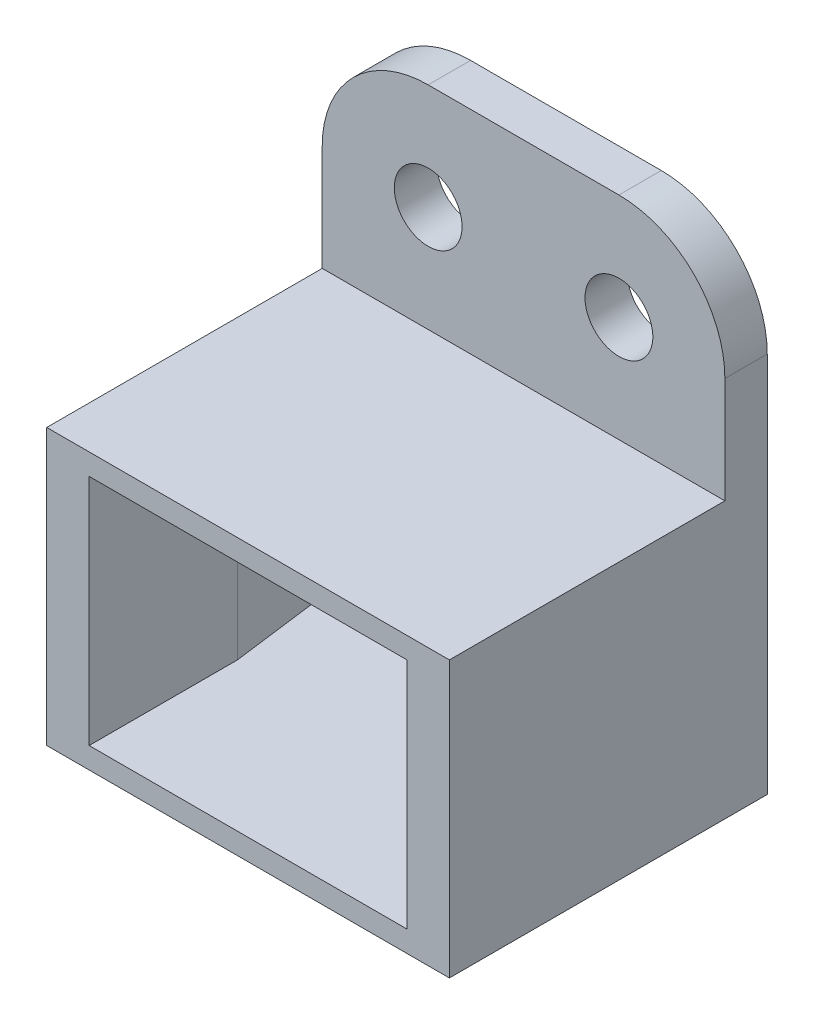
ISO-10303-21;
HEADER;
FILE_DESCRIPTION(('STEP AP214'),'2;1');
FILE_NAME('part.step','',(''),(''),'','','');
FILE_SCHEMA(('AUTOMOTIVE_DESIGN { 1 0 10303 214 1 1 1 1 }'));
ENDSEC;
DATA;
#1=APPLICATION_CONTEXT('core data for automotive mechanical design processes');
#2=APPLICATION_PROTOCOL_DEFINITION('international standard','automotive_design',2000,#1);
#3=PRODUCT_CONTEXT('',#1,'mechanical');
#4=PRODUCT('Part','Part','',(#3));
#5=PRODUCT_RELATED_PRODUCT_CATEGORY('part','',(#4));
#6=PRODUCT_DEFINITION_FORMATION('','',#4);
#7=PRODUCT_DEFINITION_CONTEXT('part definition',#1,'design');
#8=PRODUCT_DEFINITION('design','',#6,#7);
#9=PRODUCT_DEFINITION_SHAPE('','',#8);
#10=(LENGTH_UNIT() NAMED_UNIT(*) SI_UNIT(.MILLI.,.METRE.));
#11=(NAMED_UNIT(*) PLANE_ANGLE_UNIT() SI_UNIT($,.RADIAN.));
#12=(NAMED_UNIT(*) SI_UNIT($,.STERADIAN.) SOLID_ANGLE_UNIT());
#13=UNCERTAINTY_MEASURE_WITH_UNIT(LENGTH_MEASURE(1.E-05),#10,'distance_accuracy_value','');
#14=(GEOMETRIC_REPRESENTATION_CONTEXT(3) GLOBAL_UNCERTAINTY_ASSIGNED_CONTEXT((#13)) GLOBAL_UNIT_ASSIGNED_CONTEXT((#10,
#11,#12)) REPRESENTATION_CONTEXT('',''));
#15=CARTESIAN_POINT('',(0.,0.,0.));
#16=DIRECTION('',(0.,0.,1.));
#17=DIRECTION('',(1.,0.,0.));
#18=AXIS2_PLACEMENT_3D('',#15,#16,#17);
#19=CARTESIAN_POINT('',(15.,-11.,30.));
#20=DIRECTION('',(-1.,0.,0.));
#21=DIRECTION('',(0.,0.,1.));
#22=AXIS2_PLACEMENT_3D('',#19,#20,#21);
#23=PLANE('',#22);
#24=DIRECTION('',(0.,0.,-1.));
#25=VECTOR('',#24,1.);
#26=CARTESIAN_POINT('',(15.,11.,30.));
#27=LINE('',#26,#25);
#28=CARTESIAN_POINT('',(15.,11.,30.));
#29=VERTEX_POINT('',#28);
#30=CARTESIAN_POINT('',(15.,11.,16.));
#31=VERTEX_POINT('',#30);
#32=EDGE_CURVE('E254',#29,#31,#27,.T.);
#33=ORIENTED_EDGE('',*,*,#32,.T.);
#34=DIRECTION('',(0.,1.,0.));
#35=VECTOR('',#34,1.);
#36=CARTESIAN_POINT('',(15.,-27.0701586799882,16.));
#37=LINE('',#36,#35);
#38=CARTESIAN_POINT('',(15.,-11.,16.));
#39=VERTEX_POINT('',#38);
#40=EDGE_CURVE('E207',#39,#31,#37,.T.);
#41=ORIENTED_EDGE('',*,*,#40,.F.);
#42=DIRECTION('',(0.,0.,-1.));
#43=VECTOR('',#42,1.);
#44=CARTESIAN_POINT('',(15.,-11.,30.));
#45=LINE('',#44,#43);
#46=CARTESIAN_POINT('',(15.,-11.,30.));
#47=VERTEX_POINT('',#46);
#48=EDGE_CURVE('E235',#47,#39,#45,.T.);
#49=ORIENTED_EDGE('',*,*,#48,.F.);
#50=DIRECTION('',(0.,1.,0.));
#51=VECTOR('',#50,1.);
#52=CARTESIAN_POINT('',(15.,-11.,30.));
#53=LINE('',#52,#51);
#54=EDGE_CURVE('E225',#47,#29,#53,.T.);
#55=ORIENTED_EDGE('',*,*,#54,.T.);
#56=EDGE_LOOP('',(#33,#41,#49,#55));
#57=FACE_BOUND('',#56,.T.);
#58=ADVANCED_FACE('F33',(#57),#23,.T.);
#59=CARTESIAN_POINT('',(-15.,-11.,30.));
#60=DIRECTION('',(1.,0.,0.));
#61=DIRECTION('',(0.,0.,-1.));
#62=AXIS2_PLACEMENT_3D('',#59,#60,#61);
#63=PLANE('',#62);
#64=DIRECTION('',(0.,0.,-1.));
#65=VECTOR('',#64,1.);
#66=CARTESIAN_POINT('',(-15.,-11.,30.));
#67=LINE('',#66,#65);
#68=CARTESIAN_POINT('',(-15.,-11.,30.));
#69=VERTEX_POINT('',#68);
#70=CARTESIAN_POINT('',(-15.,-11.,16.));
#71=VERTEX_POINT('',#70);
#72=EDGE_CURVE('E248',#69,#71,#67,.T.);
#73=ORIENTED_EDGE('',*,*,#72,.T.);
#74=DIRECTION('',(0.,1.,0.));
#75=VECTOR('',#74,1.);
#76=CARTESIAN_POINT('',(-15.,-27.0701586799882,16.));
#77=LINE('',#76,#75);
#78=CARTESIAN_POINT('',(-15.,11.,16.));
#79=VERTEX_POINT('',#78);
#80=EDGE_CURVE('E56',#71,#79,#77,.T.);
#81=ORIENTED_EDGE('',*,*,#80,.T.);
#82=DIRECTION('',(0.,0.,-1.));
#83=VECTOR('',#82,1.);
#84=CARTESIAN_POINT('',(-15.,11.,30.));
#85=LINE('',#84,#83);
#86=CARTESIAN_POINT('',(-15.,11.,30.));
#87=VERTEX_POINT('',#86);
#88=EDGE_CURVE('E251',#87,#79,#85,.T.);
#89=ORIENTED_EDGE('',*,*,#88,.F.);
#90=DIRECTION('',(0.,-1.,0.));
#91=VECTOR('',#90,1.);
#92=CARTESIAN_POINT('',(-15.,-11.,30.));
#93=LINE('',#92,#91);
#94=EDGE_CURVE('E230',#87,#69,#93,.T.);
#95=ORIENTED_EDGE('',*,*,#94,.T.);
#96=EDGE_LOOP('',(#73,#81,#89,#95));
#97=FACE_BOUND('',#96,.T.);
#98=ADVANCED_FACE('F306',(#97),#63,.T.);
#99=CARTESIAN_POINT('',(0.,0.,30.));
#100=DIRECTION('',(0.,0.,1.));
#101=DIRECTION('',(1.,0.,0.));
#102=AXIS2_PLACEMENT_3D('',#99,#100,#101);
#103=PLANE('',#102);
#104=DIRECTION('',(0.,-1.,0.));
#105=VECTOR('',#104,1.);
#106=CARTESIAN_POINT('',(-19.,-13.,30.));
#107=LINE('',#106,#105);
#108=CARTESIAN_POINT('',(-19.,13.,30.));
#109=VERTEX_POINT('',#108);
#110=CARTESIAN_POINT('',(-19.,-13.,30.));
#111=VERTEX_POINT('',#110);
#112=EDGE_CURVE('E258',#109,#111,#107,.T.);
#113=ORIENTED_EDGE('',*,*,#112,.T.);
#114=DIRECTION('',(1.,0.,0.));
#115=VECTOR('',#114,1.);
#116=CARTESIAN_POINT('',(19.,-13.,30.));
#117=LINE('',#116,#115);
#118=CARTESIAN_POINT('',(19.,-13.,30.));
#119=VERTEX_POINT('',#118);
#120=EDGE_CURVE('E261',#111,#119,#117,.T.);
#121=ORIENTED_EDGE('',*,*,#120,.T.);
#122=DIRECTION('',(0.,1.,0.));
#123=VECTOR('',#122,1.);
#124=CARTESIAN_POINT('',(19.,-13.,30.));
#125=LINE('',#124,#123);
#126=CARTESIAN_POINT('',(19.,13.,30.));
#127=VERTEX_POINT('',#126);
#128=EDGE_CURVE('E264',#119,#127,#125,.T.);
#129=ORIENTED_EDGE('',*,*,#128,.T.);
#130=DIRECTION('',(-1.,0.,0.));
#131=VECTOR('',#130,1.);
#132=CARTESIAN_POINT('',(19.,13.,30.));
#133=LINE('',#132,#131);
#134=EDGE_CURVE('E266',#127,#109,#133,.T.);
#135=ORIENTED_EDGE('',*,*,#134,.T.);
#136=EDGE_LOOP('',(#113,#121,#129,#135));
#137=FACE_BOUND('',#136,.T.);
#138=DIRECTION('',(-1.,0.,0.));
#139=VECTOR('',#138,1.);
#140=CARTESIAN_POINT('',(-15.,11.,30.));
#141=LINE('',#140,#139);
#142=EDGE_CURVE('E227',#29,#87,#141,.T.);
#143=ORIENTED_EDGE('',*,*,#142,.F.);
#144=ORIENTED_EDGE('',*,*,#54,.F.);
#145=DIRECTION('',(1.,0.,0.));
#146=VECTOR('',#145,1.);
#147=CARTESIAN_POINT('',(-15.,-11.,30.));
#148=LINE('',#147,#146);
#149=EDGE_CURVE('E233',#69,#47,#148,.T.);
#150=ORIENTED_EDGE('',*,*,#149,.F.);
#151=ORIENTED_EDGE('',*,*,#94,.F.);
#152=EDGE_LOOP('',(#143,#144,#150,#151));
#153=FACE_BOUND('',#152,.T.);
#154=ADVANCED_FACE('F295',(#137,#153),#103,.T.);
#155=CARTESIAN_POINT('',(0.,0.,0.));
#156=DIRECTION('',(0.,0.,1.));
#157=DIRECTION('',(1.,0.,0.));
#158=AXIS2_PLACEMENT_3D('',#155,#156,#157);
#159=PLANE('',#158);
#160=DIRECTION('',(0.,-1.,0.));
#161=VECTOR('',#160,1.);
#162=CARTESIAN_POINT('',(-19.,-13.,0.));
#163=LINE('',#162,#161);
#164=CARTESIAN_POINT('',(-19.,22.9999999999999,0.));
#165=VERTEX_POINT('',#164);
#166=CARTESIAN_POINT('',(-19.,-13.,0.));
#167=VERTEX_POINT('',#166);
#168=EDGE_CURVE('E257',#165,#167,#163,.T.);
#169=ORIENTED_EDGE('',*,*,#168,.F.);
#170=CARTESIAN_POINT('',(-9.,23.,0.));
#171=DIRECTION('',(0.,0.,-1.));
#172=DIRECTION('',(-1.,0.,0.));
#173=AXIS2_PLACEMENT_3D('',#170,#171,#172);
#174=CIRCLE('',#173,10.);
#175=CARTESIAN_POINT('',(-8.99999999999993,33.,0.));
#176=VERTEX_POINT('',#175);
#177=EDGE_CURVE('E153',#165,#176,#174,.T.);
#178=ORIENTED_EDGE('',*,*,#177,.T.);
#179=DIRECTION('',(1.,0.,0.));
#180=VECTOR('',#179,1.);
#181=CARTESIAN_POINT('',(-8.99999999999993,33.,0.));
#182=LINE('',#181,#180);
#183=CARTESIAN_POINT('',(8.99999999999993,33.,0.));
#184=VERTEX_POINT('',#183);
#185=EDGE_CURVE('E172',#176,#184,#182,.T.);
#186=ORIENTED_EDGE('',*,*,#185,.T.);
#187=CARTESIAN_POINT('',(9.00000000000001,23.,0.));
#188=DIRECTION('',(0.,0.,-1.));
#189=DIRECTION('',(-1.,0.,0.));
#190=AXIS2_PLACEMENT_3D('',#187,#188,#189);
#191=CIRCLE('',#190,10.);
#192=CARTESIAN_POINT('',(19.,22.9999999999999,0.));
#193=VERTEX_POINT('',#192);
#194=EDGE_CURVE('E169',#184,#193,#191,.T.);
#195=ORIENTED_EDGE('',*,*,#194,.T.);
#196=DIRECTION('',(0.,1.,0.));
#197=VECTOR('',#196,1.);
#198=CARTESIAN_POINT('',(19.,-13.,0.));
#199=LINE('',#198,#197);
#200=CARTESIAN_POINT('',(19.,-13.,0.));
#201=VERTEX_POINT('',#200);
#202=EDGE_CURVE('E262',#201,#193,#199,.T.);
#203=ORIENTED_EDGE('',*,*,#202,.F.);
#204=DIRECTION('',(1.,0.,0.));
#205=VECTOR('',#204,1.);
#206=CARTESIAN_POINT('',(19.,-13.,0.));
#207=LINE('',#206,#205);
#208=EDGE_CURVE('E269',#167,#201,#207,.T.);
#209=ORIENTED_EDGE('',*,*,#208,.F.);
#210=EDGE_LOOP('',(#169,#178,#186,#195,#203,#209));
#211=FACE_BOUND('',#210,.T.);
#212=DIRECTION('',(0.,1.,0.));
#213=VECTOR('',#212,1.);
#214=CARTESIAN_POINT('',(15.,-11.,0.));
#215=LINE('',#214,#213);
#216=CARTESIAN_POINT('',(15.,-11.,0.));
#217=VERTEX_POINT('',#216);
#218=CARTESIAN_POINT('',(15.,11.,0.));
#219=VERTEX_POINT('',#218);
#220=EDGE_CURVE('E198',#217,#219,#215,.T.);
#221=ORIENTED_EDGE('',*,*,#220,.T.);
#222=DIRECTION('',(-1.,0.,0.));
#223=VECTOR('',#222,1.);
#224=CARTESIAN_POINT('',(-15.,11.,0.));
#225=LINE('',#224,#223);
#226=CARTESIAN_POINT('',(-15.,11.,0.));
#227=VERTEX_POINT('',#226);
#228=EDGE_CURVE('E238',#219,#227,#225,.T.);
#229=ORIENTED_EDGE('',*,*,#228,.T.);
#230=DIRECTION('',(0.,-1.,0.));
#231=VECTOR('',#230,1.);
#232=CARTESIAN_POINT('',(-15.,-11.,0.));
#233=LINE('',#232,#231);
#234=CARTESIAN_POINT('',(-15.,-11.,0.));
#235=VERTEX_POINT('',#234);
#236=EDGE_CURVE('E241',#227,#235,#233,.T.);
#237=ORIENTED_EDGE('',*,*,#236,.T.);
#238=DIRECTION('',(1.,0.,0.));
#239=VECTOR('',#238,1.);
#240=CARTESIAN_POINT('',(-15.,-11.,0.));
#241=LINE('',#240,#239);
#242=EDGE_CURVE('E228',#235,#217,#241,.T.);
#243=ORIENTED_EDGE('',*,*,#242,.T.);
#244=EDGE_LOOP('',(#221,#229,#237,#243));
#245=FACE_BOUND('',#244,.T.);
#246=CARTESIAN_POINT('',(-9.,23.,0.));
#247=DIRECTION('',(0.,0.,-1.));
#248=DIRECTION('',(-1.,0.,0.));
#249=AXIS2_PLACEMENT_3D('',#246,#247,#248);
#250=CIRCLE('',#249,3.2);
#251=CARTESIAN_POINT('',(-12.2,23.,0.));
#252=VERTEX_POINT('',#251);
#253=EDGE_CURVE('E392',#252,#252,#250,.T.);
#254=ORIENTED_EDGE('',*,*,#253,.F.);
#255=EDGE_LOOP('',(#254));
#256=FACE_BOUND('',#255,.T.);
#257=CARTESIAN_POINT('',(9.00000000000001,23.,0.));
#258=DIRECTION('',(0.,0.,-1.));
#259=DIRECTION('',(-1.,0.,0.));
#260=AXIS2_PLACEMENT_3D('',#257,#258,#259);
#261=CIRCLE('',#260,3.2);
#262=CARTESIAN_POINT('',(5.80000000000001,23.,0.));
#263=VERTEX_POINT('',#262);
#264=EDGE_CURVE('E175',#263,#263,#261,.T.);
#265=ORIENTED_EDGE('',*,*,#264,.F.);
#266=EDGE_LOOP('',(#265));
#267=FACE_BOUND('',#266,.T.);
#268=ADVANCED_FACE('F284',(#211,#245,#256,#267),#159,.F.);
#269=CARTESIAN_POINT('',(-19.,-13.,30.));
#270=DIRECTION('',(1.,0.,0.));
#271=DIRECTION('',(0.,0.,-1.));
#272=AXIS2_PLACEMENT_3D('',#269,#270,#271);
#273=PLANE('',#272);
#274=ORIENTED_EDGE('',*,*,#168,.T.);
#275=DIRECTION('',(0.,0.,-1.));
#276=VECTOR('',#275,1.);
#277=CARTESIAN_POINT('',(-19.,-13.,30.));
#278=LINE('',#277,#276);
#279=EDGE_CURVE('E11',#111,#167,#278,.T.);
#280=ORIENTED_EDGE('',*,*,#279,.F.);
#281=ORIENTED_EDGE('',*,*,#112,.F.);
#282=DIRECTION('',(0.,0.,-1.));
#283=VECTOR('',#282,1.);
#284=CARTESIAN_POINT('',(-19.,13.,30.));
#285=LINE('',#284,#283);
#286=CARTESIAN_POINT('',(-19.,13.,4.));
#287=VERTEX_POINT('',#286);
#288=EDGE_CURVE('E168',#109,#287,#285,.T.);
#289=ORIENTED_EDGE('',*,*,#288,.T.);
#290=DIRECTION('',(0.,1.,0.));
#291=VECTOR('',#290,1.);
#292=CARTESIAN_POINT('',(-19.,13.,4.));
#293=LINE('',#292,#291);
#294=CARTESIAN_POINT('',(-19.,22.9999999999999,4.));
#295=VERTEX_POINT('',#294);
#296=EDGE_CURVE('E48',#287,#295,#293,.T.);
#297=ORIENTED_EDGE('',*,*,#296,.T.);
#298=DIRECTION('',(0.,0.,-1.));
#299=VECTOR('',#298,1.);
#300=CARTESIAN_POINT('',(-19.,22.9999999999999,4.));
#301=LINE('',#300,#299);
#302=EDGE_CURVE('E149',#295,#165,#301,.T.);
#303=ORIENTED_EDGE('',*,*,#302,.T.);
#304=EDGE_LOOP('',(#274,#280,#281,#289,#297,#303));
#305=FACE_BOUND('',#304,.T.);
#306=ADVANCED_FACE('F35',(#305),#273,.F.);
#307=CARTESIAN_POINT('',(19.,-13.,30.));
#308=DIRECTION('',(0.,1.,0.));
#309=DIRECTION('',(0.,0.,1.));
#310=AXIS2_PLACEMENT_3D('',#307,#308,#309);
#311=PLANE('',#310);
#312=ORIENTED_EDGE('',*,*,#208,.T.);
#313=DIRECTION('',(0.,0.,-1.));
#314=VECTOR('',#313,1.);
#315=CARTESIAN_POINT('',(19.,-13.,30.));
#316=LINE('',#315,#314);
#317=EDGE_CURVE('E41',#119,#201,#316,.T.);
#318=ORIENTED_EDGE('',*,*,#317,.F.);
#319=ORIENTED_EDGE('',*,*,#120,.F.);
#320=ORIENTED_EDGE('',*,*,#279,.T.);
#321=EDGE_LOOP('',(#312,#318,#319,#320));
#322=FACE_BOUND('',#321,.T.);
#323=ADVANCED_FACE('F298',(#322),#311,.F.);
#324=CARTESIAN_POINT('',(19.,-13.,30.));
#325=DIRECTION('',(-1.,0.,0.));
#326=DIRECTION('',(0.,0.,1.));
#327=AXIS2_PLACEMENT_3D('',#324,#325,#326);
#328=PLANE('',#327);
#329=ORIENTED_EDGE('',*,*,#202,.T.);
#330=DIRECTION('',(0.,0.,-1.));
#331=VECTOR('',#330,1.);
#332=CARTESIAN_POINT('',(19.,22.9999999999999,4.));
#333=LINE('',#332,#331);
#334=CARTESIAN_POINT('',(19.,22.9999999999999,4.));
#335=VERTEX_POINT('',#334);
#336=EDGE_CURVE('E189',#335,#193,#333,.T.);
#337=ORIENTED_EDGE('',*,*,#336,.F.);
#338=DIRECTION('',(0.,-1.,0.));
#339=VECTOR('',#338,1.);
#340=CARTESIAN_POINT('',(19.,13.,4.));
#341=LINE('',#340,#339);
#342=CARTESIAN_POINT('',(19.,13.,4.));
#343=VERTEX_POINT('',#342);
#344=EDGE_CURVE('E182',#335,#343,#341,.T.);
#345=ORIENTED_EDGE('',*,*,#344,.T.);
#346=DIRECTION('',(0.,0.,-1.));
#347=VECTOR('',#346,1.);
#348=CARTESIAN_POINT('',(19.,13.,30.));
#349=LINE('',#348,#347);
#350=EDGE_CURVE('E273',#127,#343,#349,.T.);
#351=ORIENTED_EDGE('',*,*,#350,.F.);
#352=ORIENTED_EDGE('',*,*,#128,.F.);
#353=ORIENTED_EDGE('',*,*,#317,.T.);
#354=EDGE_LOOP('',(#329,#337,#345,#351,#352,#353));
#355=FACE_BOUND('',#354,.T.);
#356=ADVANCED_FACE('F280',(#355),#328,.F.);
#357=CARTESIAN_POINT('',(19.,13.,30.));
#358=DIRECTION('',(0.,-1.,0.));
#359=DIRECTION('',(0.,0.,-1.));
#360=AXIS2_PLACEMENT_3D('',#357,#358,#359);
#361=PLANE('',#360);
#362=ORIENTED_EDGE('',*,*,#350,.T.);
#363=DIRECTION('',(-1.,0.,0.));
#364=VECTOR('',#363,1.);
#365=CARTESIAN_POINT('',(-19.,13.,4.));
#366=LINE('',#365,#364);
#367=EDGE_CURVE('E157',#343,#287,#366,.T.);
#368=ORIENTED_EDGE('',*,*,#367,.T.);
#369=ORIENTED_EDGE('',*,*,#288,.F.);
#370=ORIENTED_EDGE('',*,*,#134,.F.);
#371=EDGE_LOOP('',(#362,#368,#369,#370));
#372=FACE_BOUND('',#371,.T.);
#373=ADVANCED_FACE('F293',(#372),#361,.F.);
#374=CARTESIAN_POINT('',(-15.,11.,30.));
#375=DIRECTION('',(0.,-1.,0.));
#376=DIRECTION('',(0.,0.,-1.));
#377=AXIS2_PLACEMENT_3D('',#374,#375,#376);
#378=PLANE('',#377);
#379=ORIENTED_EDGE('',*,*,#228,.F.);
#380=DIRECTION('',(0.316227766016838,0.,0.948683298050514));
#381=VECTOR('',#380,1.);
#382=CARTESIAN_POINT('',(15.,11.,0.));
#383=LINE('',#382,#381);
#384=CARTESIAN_POINT('',(16.5,11.,4.5));
#385=VERTEX_POINT('',#384);
#386=EDGE_CURVE('E200',#219,#385,#383,.T.);
#387=ORIENTED_EDGE('',*,*,#386,.T.);
#388=DIRECTION('',(-0.129339184067768,0.,0.991600411186222));
#389=VECTOR('',#388,1.);
#390=CARTESIAN_POINT('',(16.5,11.,4.5));
#391=LINE('',#390,#389);
#392=EDGE_CURVE('E203',#385,#31,#391,.T.);
#393=ORIENTED_EDGE('',*,*,#392,.T.);
#394=ORIENTED_EDGE('',*,*,#32,.F.);
#395=ORIENTED_EDGE('',*,*,#142,.T.);
#396=ORIENTED_EDGE('',*,*,#88,.T.);
#397=DIRECTION('',(-0.129339184067768,0.,-0.991600411186222));
#398=VECTOR('',#397,1.);
#399=CARTESIAN_POINT('',(-16.5,11.,4.5));
#400=LINE('',#399,#398);
#401=CARTESIAN_POINT('',(-16.5,11.,4.5));
#402=VERTEX_POINT('',#401);
#403=EDGE_CURVE('E192',#79,#402,#400,.T.);
#404=ORIENTED_EDGE('',*,*,#403,.T.);
#405=DIRECTION('',(0.316227766016838,0.,-0.948683298050514));
#406=VECTOR('',#405,1.);
#407=CARTESIAN_POINT('',(-15.,11.,0.));
#408=LINE('',#407,#406);
#409=EDGE_CURVE('E220',#402,#227,#408,.T.);
#410=ORIENTED_EDGE('',*,*,#409,.T.);
#411=EDGE_LOOP('',(#379,#387,#393,#394,#395,#396,#404,#410));
#412=FACE_BOUND('',#411,.T.);
#413=ADVANCED_FACE('F316',(#412),#378,.T.);
#414=CARTESIAN_POINT('',(-15.,-11.,30.));
#415=DIRECTION('',(0.,1.,0.));
#416=DIRECTION('',(0.,0.,1.));
#417=AXIS2_PLACEMENT_3D('',#414,#415,#416);
#418=PLANE('',#417);
#419=ORIENTED_EDGE('',*,*,#242,.F.);
#420=DIRECTION('',(-0.316227766016838,0.,0.948683298050514));
#421=VECTOR('',#420,1.);
#422=CARTESIAN_POINT('',(-15.,-11.,0.));
#423=LINE('',#422,#421);
#424=CARTESIAN_POINT('',(-16.5,-11.,4.5));
#425=VERTEX_POINT('',#424);
#426=EDGE_CURVE('E213',#235,#425,#423,.T.);
#427=ORIENTED_EDGE('',*,*,#426,.T.);
#428=DIRECTION('',(0.129339184067768,0.,0.991600411186222));
#429=VECTOR('',#428,1.);
#430=CARTESIAN_POINT('',(-16.5,-11.,4.5));
#431=LINE('',#430,#429);
#432=EDGE_CURVE('E204',#425,#71,#431,.T.);
#433=ORIENTED_EDGE('',*,*,#432,.T.);
#434=ORIENTED_EDGE('',*,*,#72,.F.);
#435=ORIENTED_EDGE('',*,*,#149,.T.);
#436=ORIENTED_EDGE('',*,*,#48,.T.);
#437=DIRECTION('',(0.129339184067768,0.,-0.991600411186222));
#438=VECTOR('',#437,1.);
#439=CARTESIAN_POINT('',(16.5,-11.,4.5));
#440=LINE('',#439,#438);
#441=CARTESIAN_POINT('',(16.5,-11.,4.5));
#442=VERTEX_POINT('',#441);
#443=EDGE_CURVE('E199',#39,#442,#440,.T.);
#444=ORIENTED_EDGE('',*,*,#443,.T.);
#445=DIRECTION('',(-0.316227766016838,0.,-0.948683298050514));
#446=VECTOR('',#445,1.);
#447=CARTESIAN_POINT('',(15.,-11.,0.));
#448=LINE('',#447,#446);
#449=EDGE_CURVE('E196',#442,#217,#448,.T.);
#450=ORIENTED_EDGE('',*,*,#449,.T.);
#451=EDGE_LOOP('',(#419,#427,#433,#434,#435,#436,#444,#450));
#452=FACE_BOUND('',#451,.T.);
#453=ADVANCED_FACE('F325',(#452),#418,.T.);
#454=CARTESIAN_POINT('',(-15.,-27.0701586799882,0.));
#455=DIRECTION('',(0.948683298050514,0.,0.316227766016838));
#456=DIRECTION('',(0.316227766016838,0.,-0.948683298050514));
#457=AXIS2_PLACEMENT_3D('',#454,#455,#456);
#458=PLANE('',#457);
#459=ORIENTED_EDGE('',*,*,#236,.F.);
#460=ORIENTED_EDGE('',*,*,#409,.F.);
#461=DIRECTION('',(0.,1.,0.));
#462=VECTOR('',#461,1.);
#463=CARTESIAN_POINT('',(-16.5,-27.0701586799882,4.5));
#464=LINE('',#463,#462);
#465=EDGE_CURVE('E216',#425,#402,#464,.T.);
#466=ORIENTED_EDGE('',*,*,#465,.F.);
#467=ORIENTED_EDGE('',*,*,#426,.F.);
#468=EDGE_LOOP('',(#459,#460,#466,#467));
#469=FACE_BOUND('',#468,.T.);
#470=ADVANCED_FACE('F330',(#469),#458,.T.);
#471=CARTESIAN_POINT('',(-16.5,-27.0701586799882,4.5));
#472=DIRECTION('',(0.991600411186222,0.,-0.129339184067768));
#473=DIRECTION('',(-0.129339184067768,0.,-0.991600411186222));
#474=AXIS2_PLACEMENT_3D('',#471,#472,#473);
#475=PLANE('',#474);
#476=ORIENTED_EDGE('',*,*,#465,.T.);
#477=ORIENTED_EDGE('',*,*,#403,.F.);
#478=ORIENTED_EDGE('',*,*,#80,.F.);
#479=ORIENTED_EDGE('',*,*,#432,.F.);
#480=EDGE_LOOP('',(#476,#477,#478,#479));
#481=FACE_BOUND('',#480,.T.);
#482=ADVANCED_FACE('F353',(#481),#475,.T.);
#483=CARTESIAN_POINT('',(16.5,-27.0701586799882,4.5));
#484=DIRECTION('',(-0.991600411186222,0.,-0.129339184067768));
#485=DIRECTION('',(-0.129339184067768,0.,0.991600411186222));
#486=AXIS2_PLACEMENT_3D('',#483,#484,#485);
#487=PLANE('',#486);
#488=ORIENTED_EDGE('',*,*,#40,.T.);
#489=ORIENTED_EDGE('',*,*,#392,.F.);
#490=DIRECTION('',(0.,1.,0.));
#491=VECTOR('',#490,1.);
#492=CARTESIAN_POINT('',(16.5,-27.0701586799882,4.5));
#493=LINE('',#492,#491);
#494=EDGE_CURVE('E209',#442,#385,#493,.T.);
#495=ORIENTED_EDGE('',*,*,#494,.F.);
#496=ORIENTED_EDGE('',*,*,#443,.F.);
#497=EDGE_LOOP('',(#488,#489,#495,#496));
#498=FACE_BOUND('',#497,.T.);
#499=ADVANCED_FACE('F343',(#498),#487,.T.);
#500=CARTESIAN_POINT('',(15.,-27.0701586799882,0.));
#501=DIRECTION('',(-0.948683298050514,0.,0.316227766016838));
#502=DIRECTION('',(0.316227766016838,0.,0.948683298050514));
#503=AXIS2_PLACEMENT_3D('',#500,#501,#502);
#504=PLANE('',#503);
#505=ORIENTED_EDGE('',*,*,#494,.T.);
#506=ORIENTED_EDGE('',*,*,#386,.F.);
#507=ORIENTED_EDGE('',*,*,#220,.F.);
#508=ORIENTED_EDGE('',*,*,#449,.F.);
#509=EDGE_LOOP('',(#505,#506,#507,#508));
#510=FACE_BOUND('',#509,.T.);
#511=ADVANCED_FACE('F340',(#510),#504,.T.);
#512=CARTESIAN_POINT('',(9.00000000000001,23.,4.));
#513=DIRECTION('',(0.,0.,-1.));
#514=DIRECTION('',(-1.,0.,0.));
#515=AXIS2_PLACEMENT_3D('',#512,#513,#514);
#516=CYLINDRICAL_SURFACE('',#515,10.);
#517=ORIENTED_EDGE('',*,*,#194,.F.);
#518=DIRECTION('',(0.,0.,-1.));
#519=VECTOR('',#518,1.);
#520=CARTESIAN_POINT('',(8.99999999999993,33.,4.));
#521=LINE('',#520,#519);
#522=CARTESIAN_POINT('',(8.99999999999993,33.,4.));
#523=VERTEX_POINT('',#522);
#524=EDGE_CURVE('E193',#523,#184,#521,.T.);
#525=ORIENTED_EDGE('',*,*,#524,.F.);
#526=CARTESIAN_POINT('',(9.00000000000001,23.,4.));
#527=DIRECTION('',(0.,0.,-1.));
#528=DIRECTION('',(-1.,0.,0.));
#529=AXIS2_PLACEMENT_3D('',#526,#527,#528);
#530=CIRCLE('',#529,10.);
#531=EDGE_CURVE('E179',#523,#335,#530,.T.);
#532=ORIENTED_EDGE('',*,*,#531,.T.);
#533=ORIENTED_EDGE('',*,*,#336,.T.);
#534=EDGE_LOOP('',(#517,#525,#532,#533));
#535=FACE_BOUND('',#534,.T.);
#536=ADVANCED_FACE('F289',(#535),#516,.T.);
#537=CARTESIAN_POINT('',(-8.99999999999993,33.,4.));
#538=DIRECTION('',(0.,1.,0.));
#539=DIRECTION('',(-1.,0.,0.));
#540=AXIS2_PLACEMENT_3D('',#537,#538,#539);
#541=PLANE('',#540);
#542=ORIENTED_EDGE('',*,*,#185,.F.);
#543=DIRECTION('',(0.,0.,-1.));
#544=VECTOR('',#543,1.);
#545=CARTESIAN_POINT('',(-8.99999999999993,33.,4.));
#546=LINE('',#545,#544);
#547=CARTESIAN_POINT('',(-8.99999999999993,33.,4.));
#548=VERTEX_POINT('',#547);
#549=EDGE_CURVE('E156',#548,#176,#546,.T.);
#550=ORIENTED_EDGE('',*,*,#549,.F.);
#551=DIRECTION('',(1.,0.,0.));
#552=VECTOR('',#551,1.);
#553=CARTESIAN_POINT('',(-8.99999999999993,33.,4.));
#554=LINE('',#553,#552);
#555=EDGE_CURVE('E163',#548,#523,#554,.T.);
#556=ORIENTED_EDGE('',*,*,#555,.T.);
#557=ORIENTED_EDGE('',*,*,#524,.T.);
#558=EDGE_LOOP('',(#542,#550,#556,#557));
#559=FACE_BOUND('',#558,.T.);
#560=ADVANCED_FACE('F368',(#559),#541,.T.);
#561=CARTESIAN_POINT('',(-9.,23.,4.));
#562=DIRECTION('',(0.,0.,-1.));
#563=DIRECTION('',(-1.,0.,0.));
#564=AXIS2_PLACEMENT_3D('',#561,#562,#563);
#565=CYLINDRICAL_SURFACE('',#564,10.);
#566=ORIENTED_EDGE('',*,*,#177,.F.);
#567=ORIENTED_EDGE('',*,*,#302,.F.);
#568=CARTESIAN_POINT('',(-9.,23.,4.));
#569=DIRECTION('',(0.,0.,-1.));
#570=DIRECTION('',(-1.,0.,0.));
#571=AXIS2_PLACEMENT_3D('',#568,#569,#570);
#572=CIRCLE('',#571,10.);
#573=EDGE_CURVE('E151',#295,#548,#572,.T.);
#574=ORIENTED_EDGE('',*,*,#573,.T.);
#575=ORIENTED_EDGE('',*,*,#549,.T.);
#576=EDGE_LOOP('',(#566,#567,#574,#575));
#577=FACE_BOUND('',#576,.T.);
#578=ADVANCED_FACE('F150',(#577),#565,.T.);
#579=CARTESIAN_POINT('',(-9.,23.,4.));
#580=DIRECTION('',(0.,0.,-1.));
#581=DIRECTION('',(-1.,0.,0.));
#582=AXIS2_PLACEMENT_3D('',#579,#580,#581);
#583=PLANE('',#582);
#584=CARTESIAN_POINT('',(-9.,23.,4.));
#585=DIRECTION('',(0.,0.,-1.));
#586=DIRECTION('',(-1.,0.,0.));
#587=AXIS2_PLACEMENT_3D('',#584,#585,#586);
#588=CIRCLE('',#587,3.2);
#589=CARTESIAN_POINT('',(-12.2,23.,4.));
#590=VERTEX_POINT('',#589);
#591=EDGE_CURVE('E389',#590,#590,#588,.T.);
#592=ORIENTED_EDGE('',*,*,#591,.T.);
#593=EDGE_LOOP('',(#592));
#594=FACE_BOUND('',#593,.T.);
#595=CARTESIAN_POINT('',(9.00000000000001,23.,4.));
#596=DIRECTION('',(0.,0.,-1.));
#597=DIRECTION('',(-1.,0.,0.));
#598=AXIS2_PLACEMENT_3D('',#595,#596,#597);
#599=CIRCLE('',#598,3.2);
#600=CARTESIAN_POINT('',(5.80000000000001,23.,4.));
#601=VERTEX_POINT('',#600);
#602=EDGE_CURVE('E186',#601,#601,#599,.T.);
#603=ORIENTED_EDGE('',*,*,#602,.T.);
#604=EDGE_LOOP('',(#603));
#605=FACE_BOUND('',#604,.T.);
#606=ORIENTED_EDGE('',*,*,#296,.F.);
#607=ORIENTED_EDGE('',*,*,#367,.F.);
#608=ORIENTED_EDGE('',*,*,#344,.F.);
#609=ORIENTED_EDGE('',*,*,#531,.F.);
#610=ORIENTED_EDGE('',*,*,#555,.F.);
#611=ORIENTED_EDGE('',*,*,#573,.F.);
#612=EDGE_LOOP('',(#606,#607,#608,#609,#610,#611));
#613=FACE_BOUND('',#612,.T.);
#614=ADVANCED_FACE('F160',(#594,#605,#613),#583,.F.);
#615=CARTESIAN_POINT('',(9.00000000000001,23.,4.));
#616=DIRECTION('',(0.,0.,-1.));
#617=DIRECTION('',(-1.,0.,0.));
#618=AXIS2_PLACEMENT_3D('',#615,#616,#617);
#619=CYLINDRICAL_SURFACE('',#618,3.2);
#620=ORIENTED_EDGE('',*,*,#602,.F.);
#621=EDGE_LOOP('',(#620));
#622=FACE_BOUND('',#621,.T.);
#623=ORIENTED_EDGE('',*,*,#264,.T.);
#624=EDGE_LOOP('',(#623));
#625=FACE_BOUND('',#624,.T.);
#626=ADVANCED_FACE('F376',(#622,#625),#619,.F.);
#627=CARTESIAN_POINT('',(-9.,23.,4.));
#628=DIRECTION('',(0.,0.,-1.));
#629=DIRECTION('',(-1.,0.,0.));
#630=AXIS2_PLACEMENT_3D('',#627,#628,#629);
#631=CYLINDRICAL_SURFACE('',#630,3.2);
#632=ORIENTED_EDGE('',*,*,#591,.F.);
#633=EDGE_LOOP('',(#632));
#634=FACE_BOUND('',#633,.T.);
#635=ORIENTED_EDGE('',*,*,#253,.T.);
#636=EDGE_LOOP('',(#635));
#637=FACE_BOUND('',#636,.T.);
#638=ADVANCED_FACE('F380',(#634,#637),#631,.F.);
#639=CLOSED_SHELL('',(#58,#98,#154,#268,#306,#323,#356,#373,#413,#453,#470,#482,#499,#511,#536,
#560,#578,#614,#626,#638));
#640=MANIFOLD_SOLID_BREP('B2',#639);
#641=ADVANCED_BREP_SHAPE_REPRESENTATION('',(#18,#640),#14);
#642=SHAPE_DEFINITION_REPRESENTATION(#9,#641);
ENDSEC;
END-ISO-10303-21;
